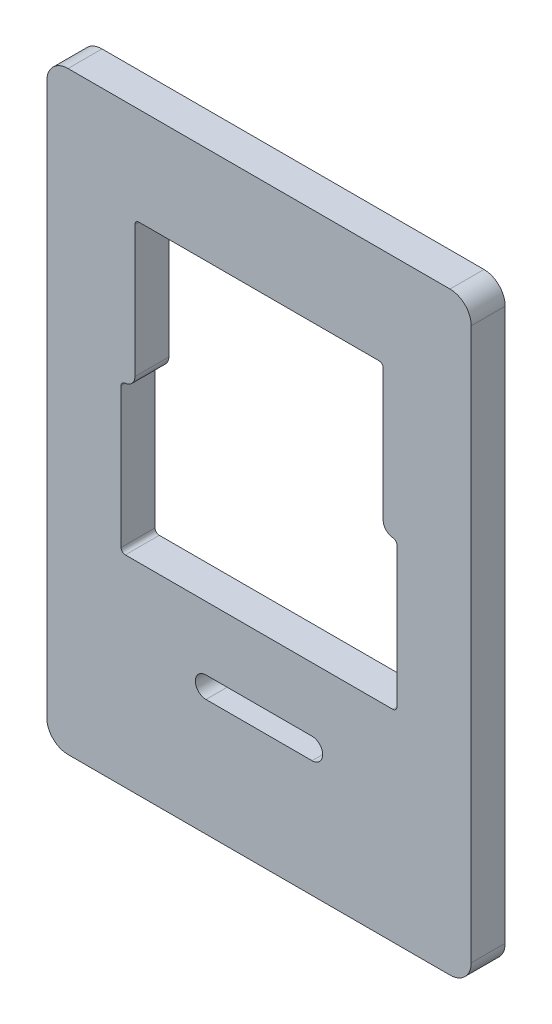
ISO-10303-21;
HEADER;
FILE_DESCRIPTION(('STEP AP214'),'2;1');
FILE_NAME('part.step','',(''),(''),'','','');
FILE_SCHEMA(('AUTOMOTIVE_DESIGN { 1 0 10303 214 1 1 1 1 }'));
ENDSEC;
DATA;
#1=APPLICATION_CONTEXT('core data for automotive mechanical design processes');
#2=APPLICATION_PROTOCOL_DEFINITION('international standard','automotive_design',2000,#1);
#3=PRODUCT_CONTEXT('',#1,'mechanical');
#4=PRODUCT('Part','Part','',(#3));
#5=PRODUCT_RELATED_PRODUCT_CATEGORY('part','',(#4));
#6=PRODUCT_DEFINITION_FORMATION('','',#4);
#7=PRODUCT_DEFINITION_CONTEXT('part definition',#1,'design');
#8=PRODUCT_DEFINITION('design','',#6,#7);
#9=PRODUCT_DEFINITION_SHAPE('','',#8);
#10=(LENGTH_UNIT() NAMED_UNIT(*) SI_UNIT(.MILLI.,.METRE.));
#11=(NAMED_UNIT(*) PLANE_ANGLE_UNIT() SI_UNIT($,.RADIAN.));
#12=(NAMED_UNIT(*) SI_UNIT($,.STERADIAN.) SOLID_ANGLE_UNIT());
#13=UNCERTAINTY_MEASURE_WITH_UNIT(LENGTH_MEASURE(1.E-05),#10,'distance_accuracy_value','');
#14=(GEOMETRIC_REPRESENTATION_CONTEXT(3) GLOBAL_UNCERTAINTY_ASSIGNED_CONTEXT((#13)) GLOBAL_UNIT_ASSIGNED_CONTEXT((#10,
#11,#12)) REPRESENTATION_CONTEXT('',''));
#15=CARTESIAN_POINT('',(0.,0.,0.));
#16=DIRECTION('',(0.,0.,1.));
#17=DIRECTION('',(1.,0.,0.));
#18=AXIS2_PLACEMENT_3D('',#15,#16,#17);
#19=CARTESIAN_POINT('',(10.,14.,-1.6));
#20=DIRECTION('',(1.,0.,0.));
#21=DIRECTION('',(0.,1.,0.));
#22=AXIS2_PLACEMENT_3D('',#19,#20,#21);
#23=PLANE('',#22);
#24=DIRECTION('',(0.,1.,0.));
#25=VECTOR('',#24,1.);
#26=CARTESIAN_POINT('',(10.,14.,0.));
#27=LINE('',#26,#25);
#28=CARTESIAN_POINT('',(10.,-13.,0.));
#29=VERTEX_POINT('',#28);
#30=CARTESIAN_POINT('',(10.,13.,0.));
#31=VERTEX_POINT('',#30);
#32=EDGE_CURVE('E249',#29,#31,#27,.T.);
#33=ORIENTED_EDGE('',*,*,#32,.F.);
#34=DIRECTION('',(0.,0.,1.));
#35=VECTOR('',#34,1.);
#36=CARTESIAN_POINT('',(10.,-13.,-1.6));
#37=LINE('',#36,#35);
#38=CARTESIAN_POINT('',(10.,-13.,-1.6));
#39=VERTEX_POINT('',#38);
#40=EDGE_CURVE('E374',#29,#39,#37,.F.);
#41=ORIENTED_EDGE('',*,*,#40,.T.);
#42=DIRECTION('',(0.,1.,0.));
#43=VECTOR('',#42,1.);
#44=CARTESIAN_POINT('',(10.,14.,-1.6));
#45=LINE('',#44,#43);
#46=CARTESIAN_POINT('',(10.,13.,-1.6));
#47=VERTEX_POINT('',#46);
#48=EDGE_CURVE('E253',#39,#47,#45,.T.);
#49=ORIENTED_EDGE('',*,*,#48,.T.);
#50=DIRECTION('',(0.,0.,1.));
#51=VECTOR('',#50,1.);
#52=CARTESIAN_POINT('',(10.,13.,-1.6));
#53=LINE('',#52,#51);
#54=EDGE_CURVE('E371',#47,#31,#53,.T.);
#55=ORIENTED_EDGE('',*,*,#54,.T.);
#56=EDGE_LOOP('',(#33,#41,#49,#55));
#57=FACE_BOUND('',#56,.T.);
#58=ADVANCED_FACE('F33',(#57),#23,.T.);
#59=CARTESIAN_POINT('',(-10.,-14.,-1.6));
#60=DIRECTION('',(0.,-1.,0.));
#61=DIRECTION('',(0.,0.,-1.));
#62=AXIS2_PLACEMENT_3D('',#59,#60,#61);
#63=PLANE('',#62);
#64=DIRECTION('',(1.,0.,0.));
#65=VECTOR('',#64,1.);
#66=CARTESIAN_POINT('',(-10.,-14.,0.));
#67=LINE('',#66,#65);
#68=CARTESIAN_POINT('',(-9.,-14.,0.));
#69=VERTEX_POINT('',#68);
#70=CARTESIAN_POINT('',(9.,-14.,0.));
#71=VERTEX_POINT('',#70);
#72=EDGE_CURVE('E257',#69,#71,#67,.T.);
#73=ORIENTED_EDGE('',*,*,#72,.F.);
#74=DIRECTION('',(0.,0.,1.));
#75=VECTOR('',#74,1.);
#76=CARTESIAN_POINT('',(-9.,-14.,-1.6));
#77=LINE('',#76,#75);
#78=CARTESIAN_POINT('',(-9.,-14.,-1.6));
#79=VERTEX_POINT('',#78);
#80=EDGE_CURVE('E362',#69,#79,#77,.F.);
#81=ORIENTED_EDGE('',*,*,#80,.T.);
#82=DIRECTION('',(1.,0.,0.));
#83=VECTOR('',#82,1.);
#84=CARTESIAN_POINT('',(-10.,-14.,-1.6));
#85=LINE('',#84,#83);
#86=CARTESIAN_POINT('',(9.,-14.,-1.6));
#87=VERTEX_POINT('',#86);
#88=EDGE_CURVE('E262',#79,#87,#85,.T.);
#89=ORIENTED_EDGE('',*,*,#88,.T.);
#90=DIRECTION('',(0.,0.,1.));
#91=VECTOR('',#90,1.);
#92=CARTESIAN_POINT('',(9.,-14.,-1.6));
#93=LINE('',#92,#91);
#94=EDGE_CURVE('E359',#87,#71,#93,.T.);
#95=ORIENTED_EDGE('',*,*,#94,.T.);
#96=EDGE_LOOP('',(#73,#81,#89,#95));
#97=FACE_BOUND('',#96,.T.);
#98=ADVANCED_FACE('F397',(#97),#63,.T.);
#99=CARTESIAN_POINT('',(-10.,14.,-1.6));
#100=DIRECTION('',(-1.,0.,0.));
#101=DIRECTION('',(0.,-1.,0.));
#102=AXIS2_PLACEMENT_3D('',#99,#100,#101);
#103=PLANE('',#102);
#104=DIRECTION('',(0.,-1.,0.));
#105=VECTOR('',#104,1.);
#106=CARTESIAN_POINT('',(-10.,14.,-1.6));
#107=LINE('',#106,#105);
#108=CARTESIAN_POINT('',(-10.,13.,-1.6));
#109=VERTEX_POINT('',#108);
#110=CARTESIAN_POINT('',(-10.,-13.,-1.6));
#111=VERTEX_POINT('',#110);
#112=EDGE_CURVE('E259',#109,#111,#107,.T.);
#113=ORIENTED_EDGE('',*,*,#112,.T.);
#114=DIRECTION('',(0.,0.,1.));
#115=VECTOR('',#114,1.);
#116=CARTESIAN_POINT('',(-10.,-13.,-1.6));
#117=LINE('',#116,#115);
#118=CARTESIAN_POINT('',(-10.,-13.,0.));
#119=VERTEX_POINT('',#118);
#120=EDGE_CURVE('E348',#111,#119,#117,.T.);
#121=ORIENTED_EDGE('',*,*,#120,.T.);
#122=DIRECTION('',(0.,-1.,0.));
#123=VECTOR('',#122,1.);
#124=CARTESIAN_POINT('',(-10.,14.,0.));
#125=LINE('',#124,#123);
#126=CARTESIAN_POINT('',(-10.,13.,0.));
#127=VERTEX_POINT('',#126);
#128=EDGE_CURVE('E271',#127,#119,#125,.T.);
#129=ORIENTED_EDGE('',*,*,#128,.F.);
#130=DIRECTION('',(0.,0.,1.));
#131=VECTOR('',#130,1.);
#132=CARTESIAN_POINT('',(-10.,13.,-1.6));
#133=LINE('',#132,#131);
#134=EDGE_CURVE('E346',#127,#109,#133,.F.);
#135=ORIENTED_EDGE('',*,*,#134,.T.);
#136=EDGE_LOOP('',(#113,#121,#129,#135));
#137=FACE_BOUND('',#136,.T.);
#138=ADVANCED_FACE('F404',(#137),#103,.T.);
#139=CARTESIAN_POINT('',(-10.,14.,-1.6));
#140=DIRECTION('',(0.,1.,0.));
#141=DIRECTION('',(0.,0.,1.));
#142=AXIS2_PLACEMENT_3D('',#139,#140,#141);
#143=PLANE('',#142);
#144=DIRECTION('',(-1.,0.,0.));
#145=VECTOR('',#144,1.);
#146=CARTESIAN_POINT('',(-10.,14.,0.));
#147=LINE('',#146,#145);
#148=CARTESIAN_POINT('',(9.,14.,0.));
#149=VERTEX_POINT('',#148);
#150=CARTESIAN_POINT('',(-9.,14.,0.));
#151=VERTEX_POINT('',#150);
#152=EDGE_CURVE('E268',#149,#151,#147,.T.);
#153=ORIENTED_EDGE('',*,*,#152,.F.);
#154=DIRECTION('',(0.,0.,1.));
#155=VECTOR('',#154,1.);
#156=CARTESIAN_POINT('',(9.,14.,-1.6));
#157=LINE('',#156,#155);
#158=CARTESIAN_POINT('',(9.,14.,-1.6));
#159=VERTEX_POINT('',#158);
#160=EDGE_CURVE('E11',#149,#159,#157,.F.);
#161=ORIENTED_EDGE('',*,*,#160,.T.);
#162=DIRECTION('',(-1.,0.,0.));
#163=VECTOR('',#162,1.);
#164=CARTESIAN_POINT('',(-10.,14.,-1.6));
#165=LINE('',#164,#163);
#166=CARTESIAN_POINT('',(-9.,14.,-1.6));
#167=VERTEX_POINT('',#166);
#168=EDGE_CURVE('E256',#159,#167,#165,.T.);
#169=ORIENTED_EDGE('',*,*,#168,.T.);
#170=DIRECTION('',(0.,0.,1.));
#171=VECTOR('',#170,1.);
#172=CARTESIAN_POINT('',(-9.,14.,-1.6));
#173=LINE('',#172,#171);
#174=EDGE_CURVE('E41',#167,#151,#173,.T.);
#175=ORIENTED_EDGE('',*,*,#174,.T.);
#176=EDGE_LOOP('',(#153,#161,#169,#175));
#177=FACE_BOUND('',#176,.T.);
#178=ADVANCED_FACE('F377',(#177),#143,.T.);
#179=CARTESIAN_POINT('',(0.,0.,-1.6));
#180=DIRECTION('',(0.,0.,1.));
#181=DIRECTION('',(1.,0.,0.));
#182=AXIS2_PLACEMENT_3D('',#179,#180,#181);
#183=PLANE('',#182);
#184=DIRECTION('',(0.,1.,0.));
#185=VECTOR('',#184,1.);
#186=CARTESIAN_POINT('',(6.5,2.5,-1.6));
#187=LINE('',#186,#185);
#188=CARTESIAN_POINT('',(6.5,-4.3,-1.6));
#189=VERTEX_POINT('',#188);
#190=CARTESIAN_POINT('',(6.5,2.30178799781155,-1.6));
#191=VERTEX_POINT('',#190);
#192=EDGE_CURVE('E646',#189,#191,#187,.T.);
#193=ORIENTED_EDGE('',*,*,#192,.T.);
#194=CARTESIAN_POINT('',(6.3,2.30178799781155,-1.6));
#195=DIRECTION('',(0.,0.,1.));
#196=DIRECTION('',(1.,0.,0.));
#197=AXIS2_PLACEMENT_3D('',#194,#195,#196);
#198=CIRCLE('',#197,0.2);
#199=CARTESIAN_POINT('',(6.31428571428571,2.50127714129396,-1.6));
#200=VERTEX_POINT('',#199);
#201=EDGE_CURVE('E332',#191,#200,#198,.T.);
#202=ORIENTED_EDGE('',*,*,#201,.T.);
#203=CARTESIAN_POINT('',(6.35,3.,-1.6));
#204=DIRECTION('',(0.,0.,1.));
#205=DIRECTION('',(1.,0.,0.));
#206=AXIS2_PLACEMENT_3D('',#203,#204,#205);
#207=CIRCLE('',#206,0.5);
#208=CARTESIAN_POINT('',(5.85,3.,-1.6));
#209=VERTEX_POINT('',#208);
#210=EDGE_CURVE('E287',#200,#209,#207,.F.);
#211=ORIENTED_EDGE('',*,*,#210,.T.);
#212=DIRECTION('',(0.,1.,0.));
#213=VECTOR('',#212,1.);
#214=CARTESIAN_POINT('',(5.85,9.4,-1.6));
#215=LINE('',#214,#213);
#216=CARTESIAN_POINT('',(5.85,9.2,-1.6));
#217=VERTEX_POINT('',#216);
#218=EDGE_CURVE('E674',#209,#217,#215,.T.);
#219=ORIENTED_EDGE('',*,*,#218,.T.);
#220=CARTESIAN_POINT('',(5.65,9.2,-1.6));
#221=DIRECTION('',(0.,0.,1.));
#222=DIRECTION('',(1.,0.,0.));
#223=AXIS2_PLACEMENT_3D('',#220,#221,#222);
#224=CIRCLE('',#223,0.2);
#225=CARTESIAN_POINT('',(5.65,9.4,-1.6));
#226=VERTEX_POINT('',#225);
#227=EDGE_CURVE('E344',#217,#226,#224,.T.);
#228=ORIENTED_EDGE('',*,*,#227,.T.);
#229=DIRECTION('',(-1.,0.,0.));
#230=VECTOR('',#229,1.);
#231=CARTESIAN_POINT('',(-5.85,9.4,-1.6));
#232=LINE('',#231,#230);
#233=CARTESIAN_POINT('',(-5.65,9.4,-1.6));
#234=VERTEX_POINT('',#233);
#235=EDGE_CURVE('E705',#226,#234,#232,.T.);
#236=ORIENTED_EDGE('',*,*,#235,.T.);
#237=CARTESIAN_POINT('',(-5.65,9.2,-1.6));
#238=DIRECTION('',(0.,0.,1.));
#239=DIRECTION('',(1.,0.,0.));
#240=AXIS2_PLACEMENT_3D('',#237,#238,#239);
#241=CIRCLE('',#240,0.2);
#242=CARTESIAN_POINT('',(-5.85,9.2,-1.6));
#243=VERTEX_POINT('',#242);
#244=EDGE_CURVE('E340',#234,#243,#241,.T.);
#245=ORIENTED_EDGE('',*,*,#244,.T.);
#246=DIRECTION('',(0.,-1.,0.));
#247=VECTOR('',#246,1.);
#248=CARTESIAN_POINT('',(-5.85,9.4,-1.6));
#249=LINE('',#248,#247);
#250=CARTESIAN_POINT('',(-5.85,3.,-1.6));
#251=VERTEX_POINT('',#250);
#252=EDGE_CURVE('E671',#243,#251,#249,.T.);
#253=ORIENTED_EDGE('',*,*,#252,.T.);
#254=CARTESIAN_POINT('',(-6.35,3.,-1.6));
#255=DIRECTION('',(0.,0.,1.));
#256=DIRECTION('',(1.,0.,0.));
#257=AXIS2_PLACEMENT_3D('',#254,#255,#256);
#258=CIRCLE('',#257,0.5);
#259=CARTESIAN_POINT('',(-6.31428571428571,2.50127714129396,-1.6));
#260=VERTEX_POINT('',#259);
#261=EDGE_CURVE('E284',#251,#260,#258,.F.);
#262=ORIENTED_EDGE('',*,*,#261,.T.);
#263=CARTESIAN_POINT('',(-6.3,2.30178799781155,-1.6));
#264=DIRECTION('',(0.,0.,1.));
#265=DIRECTION('',(1.,0.,0.));
#266=AXIS2_PLACEMENT_3D('',#263,#264,#265);
#267=CIRCLE('',#266,0.2);
#268=CARTESIAN_POINT('',(-6.5,2.30178799781155,-1.6));
#269=VERTEX_POINT('',#268);
#270=EDGE_CURVE('E336',#260,#269,#267,.T.);
#271=ORIENTED_EDGE('',*,*,#270,.T.);
#272=DIRECTION('',(0.,-1.,0.));
#273=VECTOR('',#272,1.);
#274=CARTESIAN_POINT('',(-6.5,2.5,-1.6));
#275=LINE('',#274,#273);
#276=CARTESIAN_POINT('',(-6.5,-4.3,-1.6));
#277=VERTEX_POINT('',#276);
#278=EDGE_CURVE('E652',#269,#277,#275,.T.);
#279=ORIENTED_EDGE('',*,*,#278,.T.);
#280=CARTESIAN_POINT('',(-6.3,-4.3,-1.6));
#281=DIRECTION('',(0.,0.,1.));
#282=DIRECTION('',(1.,0.,0.));
#283=AXIS2_PLACEMENT_3D('',#280,#281,#282);
#284=CIRCLE('',#283,0.2);
#285=CARTESIAN_POINT('',(-6.3,-4.5,-1.6));
#286=VERTEX_POINT('',#285);
#287=EDGE_CURVE('E324',#277,#286,#284,.T.);
#288=ORIENTED_EDGE('',*,*,#287,.T.);
#289=DIRECTION('',(1.,0.,0.));
#290=VECTOR('',#289,1.);
#291=CARTESIAN_POINT('',(-6.5,-4.5,-1.6));
#292=LINE('',#291,#290);
#293=CARTESIAN_POINT('',(6.3,-4.5,-1.6));
#294=VERTEX_POINT('',#293);
#295=EDGE_CURVE('E243',#286,#294,#292,.T.);
#296=ORIENTED_EDGE('',*,*,#295,.T.);
#297=CARTESIAN_POINT('',(6.3,-4.3,-1.6));
#298=DIRECTION('',(0.,0.,1.));
#299=DIRECTION('',(1.,0.,0.));
#300=AXIS2_PLACEMENT_3D('',#297,#298,#299);
#301=CIRCLE('',#300,0.2);
#302=EDGE_CURVE('E328',#294,#189,#301,.T.);
#303=ORIENTED_EDGE('',*,*,#302,.T.);
#304=EDGE_LOOP('',(#193,#202,#211,#219,#228,#236,#245,#253,#262,#271,#279,#288,#296,#303));
#305=FACE_BOUND('',#304,.T.);
#306=DIRECTION('',(-1.,0.,0.));
#307=VECTOR('',#306,1.);
#308=CARTESIAN_POINT('',(-2.5,-7.5,-1.6));
#309=LINE('',#308,#307);
#310=CARTESIAN_POINT('',(2.5,-7.5,-1.6));
#311=VERTEX_POINT('',#310);
#312=CARTESIAN_POINT('',(-2.5,-7.5,-1.6));
#313=VERTEX_POINT('',#312);
#314=EDGE_CURVE('E218',#311,#313,#309,.T.);
#315=ORIENTED_EDGE('',*,*,#314,.T.);
#316=CARTESIAN_POINT('',(-2.5,-8.,-1.6));
#317=DIRECTION('',(0.,0.,1.));
#318=DIRECTION('',(1.,0.,0.));
#319=AXIS2_PLACEMENT_3D('',#316,#317,#318);
#320=CIRCLE('',#319,0.5);
#321=CARTESIAN_POINT('',(-2.5,-8.5,-1.6));
#322=VERTEX_POINT('',#321);
#323=EDGE_CURVE('E210',#313,#322,#320,.T.);
#324=ORIENTED_EDGE('',*,*,#323,.T.);
#325=DIRECTION('',(1.,0.,0.));
#326=VECTOR('',#325,1.);
#327=CARTESIAN_POINT('',(-2.5,-8.5,-1.6));
#328=LINE('',#327,#326);
#329=CARTESIAN_POINT('',(2.5,-8.5,-1.6));
#330=VERTEX_POINT('',#329);
#331=EDGE_CURVE('E222',#322,#330,#328,.T.);
#332=ORIENTED_EDGE('',*,*,#331,.T.);
#333=CARTESIAN_POINT('',(2.5,-8.,-1.6));
#334=DIRECTION('',(0.,0.,1.));
#335=DIRECTION('',(1.,0.,0.));
#336=AXIS2_PLACEMENT_3D('',#333,#334,#335);
#337=CIRCLE('',#336,0.5);
#338=EDGE_CURVE('E226',#330,#311,#337,.T.);
#339=ORIENTED_EDGE('',*,*,#338,.T.);
#340=EDGE_LOOP('',(#315,#324,#332,#339));
#341=FACE_BOUND('',#340,.T.);
#342=ORIENTED_EDGE('',*,*,#88,.F.);
#343=CARTESIAN_POINT('',(-9.,-13.,-1.6));
#344=DIRECTION('',(0.,0.,1.));
#345=DIRECTION('',(1.,0.,0.));
#346=AXIS2_PLACEMENT_3D('',#343,#344,#345);
#347=CIRCLE('',#346,1.);
#348=EDGE_CURVE('E369',#79,#111,#347,.F.);
#349=ORIENTED_EDGE('',*,*,#348,.T.);
#350=ORIENTED_EDGE('',*,*,#112,.F.);
#351=CARTESIAN_POINT('',(-9.,13.,-1.6));
#352=DIRECTION('',(0.,0.,1.));
#353=DIRECTION('',(1.,0.,0.));
#354=AXIS2_PLACEMENT_3D('',#351,#352,#353);
#355=CIRCLE('',#354,1.);
#356=EDGE_CURVE('E48',#109,#167,#355,.F.);
#357=ORIENTED_EDGE('',*,*,#356,.T.);
#358=ORIENTED_EDGE('',*,*,#168,.F.);
#359=CARTESIAN_POINT('',(9.,13.,-1.6));
#360=DIRECTION('',(0.,0.,1.));
#361=DIRECTION('',(1.,0.,0.));
#362=AXIS2_PLACEMENT_3D('',#359,#360,#361);
#363=CIRCLE('',#362,1.);
#364=EDGE_CURVE('E365',#159,#47,#363,.F.);
#365=ORIENTED_EDGE('',*,*,#364,.T.);
#366=ORIENTED_EDGE('',*,*,#48,.F.);
#367=CARTESIAN_POINT('',(9.,-13.,-1.6));
#368=DIRECTION('',(0.,0.,1.));
#369=DIRECTION('',(1.,0.,0.));
#370=AXIS2_PLACEMENT_3D('',#367,#368,#369);
#371=CIRCLE('',#370,1.);
#372=EDGE_CURVE('E367',#39,#87,#371,.F.);
#373=ORIENTED_EDGE('',*,*,#372,.T.);
#374=EDGE_LOOP('',(#342,#349,#350,#357,#358,#365,#366,#373));
#375=FACE_BOUND('',#374,.T.);
#376=ADVANCED_FACE('F228',(#305,#341,#375),#183,.F.);
#377=CARTESIAN_POINT('',(0.,0.,0.));
#378=DIRECTION('',(0.,0.,1.));
#379=DIRECTION('',(1.,0.,0.));
#380=AXIS2_PLACEMENT_3D('',#377,#378,#379);
#381=PLANE('',#380);
#382=DIRECTION('',(0.,1.,0.));
#383=VECTOR('',#382,1.);
#384=CARTESIAN_POINT('',(5.85,9.4,0.));
#385=LINE('',#384,#383);
#386=CARTESIAN_POINT('',(5.85,3.,0.));
#387=VERTEX_POINT('',#386);
#388=CARTESIAN_POINT('',(5.85,9.2,0.));
#389=VERTEX_POINT('',#388);
#390=EDGE_CURVE('E662',#387,#389,#385,.T.);
#391=ORIENTED_EDGE('',*,*,#390,.F.);
#392=CARTESIAN_POINT('',(6.35,3.,0.));
#393=DIRECTION('',(0.,0.,1.));
#394=DIRECTION('',(1.,0.,0.));
#395=AXIS2_PLACEMENT_3D('',#392,#393,#394);
#396=CIRCLE('',#395,0.5);
#397=CARTESIAN_POINT('',(6.31428571428571,2.50127714129396,0.));
#398=VERTEX_POINT('',#397);
#399=EDGE_CURVE('E281',#387,#398,#396,.T.);
#400=ORIENTED_EDGE('',*,*,#399,.T.);
#401=CARTESIAN_POINT('',(6.3,2.30178799781155,0.));
#402=DIRECTION('',(0.,0.,1.));
#403=DIRECTION('',(1.,0.,0.));
#404=AXIS2_PLACEMENT_3D('',#401,#402,#403);
#405=CIRCLE('',#404,0.2);
#406=CARTESIAN_POINT('',(6.5,2.30178799781155,0.));
#407=VERTEX_POINT('',#406);
#408=EDGE_CURVE('E330',#398,#407,#405,.F.);
#409=ORIENTED_EDGE('',*,*,#408,.T.);
#410=DIRECTION('',(0.,1.,0.));
#411=VECTOR('',#410,1.);
#412=CARTESIAN_POINT('',(6.5,2.5,0.));
#413=LINE('',#412,#411);
#414=CARTESIAN_POINT('',(6.5,-4.3,0.));
#415=VERTEX_POINT('',#414);
#416=EDGE_CURVE('E679',#415,#407,#413,.T.);
#417=ORIENTED_EDGE('',*,*,#416,.F.);
#418=CARTESIAN_POINT('',(6.3,-4.3,0.));
#419=DIRECTION('',(0.,0.,1.));
#420=DIRECTION('',(1.,0.,0.));
#421=AXIS2_PLACEMENT_3D('',#418,#419,#420);
#422=CIRCLE('',#421,0.2);
#423=CARTESIAN_POINT('',(6.3,-4.5,0.));
#424=VERTEX_POINT('',#423);
#425=EDGE_CURVE('E326',#415,#424,#422,.F.);
#426=ORIENTED_EDGE('',*,*,#425,.T.);
#427=DIRECTION('',(1.,0.,0.));
#428=VECTOR('',#427,1.);
#429=CARTESIAN_POINT('',(-6.5,-4.5,0.));
#430=LINE('',#429,#428);
#431=CARTESIAN_POINT('',(-6.3,-4.5,0.));
#432=VERTEX_POINT('',#431);
#433=EDGE_CURVE('E236',#432,#424,#430,.T.);
#434=ORIENTED_EDGE('',*,*,#433,.F.);
#435=CARTESIAN_POINT('',(-6.3,-4.3,0.));
#436=DIRECTION('',(0.,0.,1.));
#437=DIRECTION('',(1.,0.,0.));
#438=AXIS2_PLACEMENT_3D('',#435,#436,#437);
#439=CIRCLE('',#438,0.2);
#440=CARTESIAN_POINT('',(-6.5,-4.3,0.));
#441=VERTEX_POINT('',#440);
#442=EDGE_CURVE('E322',#432,#441,#439,.F.);
#443=ORIENTED_EDGE('',*,*,#442,.T.);
#444=DIRECTION('',(0.,-1.,0.));
#445=VECTOR('',#444,1.);
#446=CARTESIAN_POINT('',(-6.5,2.5,0.));
#447=LINE('',#446,#445);
#448=CARTESIAN_POINT('',(-6.5,2.30178799781155,0.));
#449=VERTEX_POINT('',#448);
#450=EDGE_CURVE('E680',#449,#441,#447,.T.);
#451=ORIENTED_EDGE('',*,*,#450,.F.);
#452=CARTESIAN_POINT('',(-6.3,2.30178799781155,0.));
#453=DIRECTION('',(0.,0.,1.));
#454=DIRECTION('',(1.,0.,0.));
#455=AXIS2_PLACEMENT_3D('',#452,#453,#454);
#456=CIRCLE('',#455,0.2);
#457=CARTESIAN_POINT('',(-6.31428571428571,2.50127714129396,0.));
#458=VERTEX_POINT('',#457);
#459=EDGE_CURVE('E334',#449,#458,#456,.F.);
#460=ORIENTED_EDGE('',*,*,#459,.T.);
#461=CARTESIAN_POINT('',(-6.35,3.,0.));
#462=DIRECTION('',(0.,0.,1.));
#463=DIRECTION('',(1.,0.,0.));
#464=AXIS2_PLACEMENT_3D('',#461,#462,#463);
#465=CIRCLE('',#464,0.5);
#466=CARTESIAN_POINT('',(-5.85,3.,0.));
#467=VERTEX_POINT('',#466);
#468=EDGE_CURVE('E278',#458,#467,#465,.T.);
#469=ORIENTED_EDGE('',*,*,#468,.T.);
#470=DIRECTION('',(0.,-1.,0.));
#471=VECTOR('',#470,1.);
#472=CARTESIAN_POINT('',(-5.85,9.4,0.));
#473=LINE('',#472,#471);
#474=CARTESIAN_POINT('',(-5.85,9.2,0.));
#475=VERTEX_POINT('',#474);
#476=EDGE_CURVE('E668',#475,#467,#473,.T.);
#477=ORIENTED_EDGE('',*,*,#476,.F.);
#478=CARTESIAN_POINT('',(-5.65,9.2,0.));
#479=DIRECTION('',(0.,0.,1.));
#480=DIRECTION('',(1.,0.,0.));
#481=AXIS2_PLACEMENT_3D('',#478,#479,#480);
#482=CIRCLE('',#481,0.2);
#483=CARTESIAN_POINT('',(-5.65,9.4,0.));
#484=VERTEX_POINT('',#483);
#485=EDGE_CURVE('E338',#475,#484,#482,.F.);
#486=ORIENTED_EDGE('',*,*,#485,.T.);
#487=DIRECTION('',(-1.,0.,0.));
#488=VECTOR('',#487,1.);
#489=CARTESIAN_POINT('',(-5.85,9.4,0.));
#490=LINE('',#489,#488);
#491=CARTESIAN_POINT('',(5.65,9.4,0.));
#492=VERTEX_POINT('',#491);
#493=EDGE_CURVE('E665',#492,#484,#490,.T.);
#494=ORIENTED_EDGE('',*,*,#493,.F.);
#495=CARTESIAN_POINT('',(5.65,9.2,0.));
#496=DIRECTION('',(0.,0.,1.));
#497=DIRECTION('',(1.,0.,0.));
#498=AXIS2_PLACEMENT_3D('',#495,#496,#497);
#499=CIRCLE('',#498,0.2);
#500=EDGE_CURVE('E342',#492,#389,#499,.F.);
#501=ORIENTED_EDGE('',*,*,#500,.T.);
#502=EDGE_LOOP('',(#391,#400,#409,#417,#426,#434,#443,#451,#460,#469,#477,#486,#494,#501));
#503=FACE_BOUND('',#502,.T.);
#504=CARTESIAN_POINT('',(-2.5,-8.,0.));
#505=DIRECTION('',(0.,0.,1.));
#506=DIRECTION('',(1.,0.,0.));
#507=AXIS2_PLACEMENT_3D('',#504,#505,#506);
#508=CIRCLE('',#507,0.5);
#509=CARTESIAN_POINT('',(-2.5,-7.5,0.));
#510=VERTEX_POINT('',#509);
#511=CARTESIAN_POINT('',(-2.5,-8.5,0.));
#512=VERTEX_POINT('',#511);
#513=EDGE_CURVE('E213',#510,#512,#508,.T.);
#514=ORIENTED_EDGE('',*,*,#513,.F.);
#515=DIRECTION('',(-1.,0.,0.));
#516=VECTOR('',#515,1.);
#517=CARTESIAN_POINT('',(-2.5,-7.5,0.));
#518=LINE('',#517,#516);
#519=CARTESIAN_POINT('',(2.5,-7.5,0.));
#520=VERTEX_POINT('',#519);
#521=EDGE_CURVE('E230',#520,#510,#518,.T.);
#522=ORIENTED_EDGE('',*,*,#521,.F.);
#523=CARTESIAN_POINT('',(2.5,-8.,0.));
#524=DIRECTION('',(0.,0.,1.));
#525=DIRECTION('',(1.,0.,0.));
#526=AXIS2_PLACEMENT_3D('',#523,#524,#525);
#527=CIRCLE('',#526,0.5);
#528=CARTESIAN_POINT('',(2.5,-8.5,0.));
#529=VERTEX_POINT('',#528);
#530=EDGE_CURVE('E233',#529,#520,#527,.T.);
#531=ORIENTED_EDGE('',*,*,#530,.F.);
#532=DIRECTION('',(1.,0.,0.));
#533=VECTOR('',#532,1.);
#534=CARTESIAN_POINT('',(-2.5,-8.5,0.));
#535=LINE('',#534,#533);
#536=EDGE_CURVE('E242',#512,#529,#535,.T.);
#537=ORIENTED_EDGE('',*,*,#536,.F.);
#538=EDGE_LOOP('',(#514,#522,#531,#537));
#539=FACE_BOUND('',#538,.T.);
#540=ORIENTED_EDGE('',*,*,#128,.T.);
#541=CARTESIAN_POINT('',(-9.,-13.,0.));
#542=DIRECTION('',(0.,0.,1.));
#543=DIRECTION('',(1.,0.,0.));
#544=AXIS2_PLACEMENT_3D('',#541,#542,#543);
#545=CIRCLE('',#544,1.);
#546=EDGE_CURVE('E357',#119,#69,#545,.T.);
#547=ORIENTED_EDGE('',*,*,#546,.T.);
#548=ORIENTED_EDGE('',*,*,#72,.T.);
#549=CARTESIAN_POINT('',(9.,-13.,0.));
#550=DIRECTION('',(0.,0.,1.));
#551=DIRECTION('',(1.,0.,0.));
#552=AXIS2_PLACEMENT_3D('',#549,#550,#551);
#553=CIRCLE('',#552,1.);
#554=EDGE_CURVE('E355',#71,#29,#553,.T.);
#555=ORIENTED_EDGE('',*,*,#554,.T.);
#556=ORIENTED_EDGE('',*,*,#32,.T.);
#557=CARTESIAN_POINT('',(9.,13.,0.));
#558=DIRECTION('',(0.,0.,1.));
#559=DIRECTION('',(1.,0.,0.));
#560=AXIS2_PLACEMENT_3D('',#557,#558,#559);
#561=CIRCLE('',#560,1.);
#562=EDGE_CURVE('E353',#31,#149,#561,.T.);
#563=ORIENTED_EDGE('',*,*,#562,.T.);
#564=ORIENTED_EDGE('',*,*,#152,.T.);
#565=CARTESIAN_POINT('',(-9.,13.,0.));
#566=DIRECTION('',(0.,0.,1.));
#567=DIRECTION('',(1.,0.,0.));
#568=AXIS2_PLACEMENT_3D('',#565,#566,#567);
#569=CIRCLE('',#568,1.);
#570=EDGE_CURVE('E351',#151,#127,#569,.T.);
#571=ORIENTED_EDGE('',*,*,#570,.T.);
#572=EDGE_LOOP('',(#540,#547,#548,#555,#556,#563,#564,#571));
#573=FACE_BOUND('',#572,.T.);
#574=ADVANCED_FACE('F380',(#503,#539,#573),#381,.T.);
#575=CARTESIAN_POINT('',(-2.5,-8.,-1.6));
#576=DIRECTION('',(0.,0.,1.));
#577=DIRECTION('',(1.,0.,0.));
#578=AXIS2_PLACEMENT_3D('',#575,#576,#577);
#579=CYLINDRICAL_SURFACE('',#578,0.5);
#580=ORIENTED_EDGE('',*,*,#513,.T.);
#581=DIRECTION('',(0.,0.,1.));
#582=VECTOR('',#581,1.);
#583=CARTESIAN_POINT('',(-2.5,-8.5,-1.6));
#584=LINE('',#583,#582);
#585=EDGE_CURVE('E206',#322,#512,#584,.T.);
#586=ORIENTED_EDGE('',*,*,#585,.F.);
#587=ORIENTED_EDGE('',*,*,#323,.F.);
#588=DIRECTION('',(0.,0.,1.));
#589=VECTOR('',#588,1.);
#590=CARTESIAN_POINT('',(-2.5,-7.5,-1.6));
#591=LINE('',#590,#589);
#592=EDGE_CURVE('E247',#313,#510,#591,.T.);
#593=ORIENTED_EDGE('',*,*,#592,.T.);
#594=EDGE_LOOP('',(#580,#586,#587,#593));
#595=FACE_BOUND('',#594,.T.);
#596=ADVANCED_FACE('F208',(#595),#579,.F.);
#597=CARTESIAN_POINT('',(-2.5,-7.5,-1.6));
#598=DIRECTION('',(0.,1.,0.));
#599=DIRECTION('',(-1.,0.,0.));
#600=AXIS2_PLACEMENT_3D('',#597,#598,#599);
#601=PLANE('',#600);
#602=ORIENTED_EDGE('',*,*,#521,.T.);
#603=ORIENTED_EDGE('',*,*,#592,.F.);
#604=ORIENTED_EDGE('',*,*,#314,.F.);
#605=DIRECTION('',(0.,0.,1.));
#606=VECTOR('',#605,1.);
#607=CARTESIAN_POINT('',(2.5,-7.5,-1.6));
#608=LINE('',#607,#606);
#609=EDGE_CURVE('E250',#311,#520,#608,.T.);
#610=ORIENTED_EDGE('',*,*,#609,.T.);
#611=EDGE_LOOP('',(#602,#603,#604,#610));
#612=FACE_BOUND('',#611,.T.);
#613=ADVANCED_FACE('F585',(#612),#601,.F.);
#614=CARTESIAN_POINT('',(2.5,-8.,-1.6));
#615=DIRECTION('',(0.,0.,1.));
#616=DIRECTION('',(1.,0.,0.));
#617=AXIS2_PLACEMENT_3D('',#614,#615,#616);
#618=CYLINDRICAL_SURFACE('',#617,0.5);
#619=ORIENTED_EDGE('',*,*,#530,.T.);
#620=ORIENTED_EDGE('',*,*,#609,.F.);
#621=ORIENTED_EDGE('',*,*,#338,.F.);
#622=DIRECTION('',(0.,0.,1.));
#623=VECTOR('',#622,1.);
#624=CARTESIAN_POINT('',(2.5,-8.5,-1.6));
#625=LINE('',#624,#623);
#626=EDGE_CURVE('E217',#330,#529,#625,.T.);
#627=ORIENTED_EDGE('',*,*,#626,.T.);
#628=EDGE_LOOP('',(#619,#620,#621,#627));
#629=FACE_BOUND('',#628,.T.);
#630=ADVANCED_FACE('F577',(#629),#618,.F.);
#631=CARTESIAN_POINT('',(-2.5,-8.5,-1.6));
#632=DIRECTION('',(0.,-1.,0.));
#633=DIRECTION('',(1.,0.,0.));
#634=AXIS2_PLACEMENT_3D('',#631,#632,#633);
#635=PLANE('',#634);
#636=ORIENTED_EDGE('',*,*,#536,.T.);
#637=ORIENTED_EDGE('',*,*,#626,.F.);
#638=ORIENTED_EDGE('',*,*,#331,.F.);
#639=ORIENTED_EDGE('',*,*,#585,.T.);
#640=EDGE_LOOP('',(#636,#637,#638,#639));
#641=FACE_BOUND('',#640,.T.);
#642=ADVANCED_FACE('F223',(#641),#635,.F.);
#643=CARTESIAN_POINT('',(6.5,2.5,-1.6));
#644=DIRECTION('',(1.,0.,0.));
#645=DIRECTION('',(0.,0.,-1.));
#646=AXIS2_PLACEMENT_3D('',#643,#644,#645);
#647=PLANE('',#646);
#648=ORIENTED_EDGE('',*,*,#192,.F.);
#649=DIRECTION('',(0.,0.,1.));
#650=VECTOR('',#649,1.);
#651=CARTESIAN_POINT('',(6.5,-4.3,0.));
#652=LINE('',#651,#650);
#653=EDGE_CURVE('E304',#189,#415,#652,.T.);
#654=ORIENTED_EDGE('',*,*,#653,.T.);
#655=ORIENTED_EDGE('',*,*,#416,.T.);
#656=DIRECTION('',(0.,0.,1.));
#657=VECTOR('',#656,1.);
#658=CARTESIAN_POINT('',(6.5,2.30178799781155,-1.6));
#659=LINE('',#658,#657);
#660=EDGE_CURVE('E302',#407,#191,#659,.F.);
#661=ORIENTED_EDGE('',*,*,#660,.T.);
#662=EDGE_LOOP('',(#648,#654,#655,#661));
#663=FACE_BOUND('',#662,.T.);
#664=ADVANCED_FACE('F560',(#663),#647,.F.);
#665=CARTESIAN_POINT('',(-6.5,-4.5,-1.6));
#666=DIRECTION('',(0.,-1.,0.));
#667=DIRECTION('',(0.,0.,-1.));
#668=AXIS2_PLACEMENT_3D('',#665,#666,#667);
#669=PLANE('',#668);
#670=ORIENTED_EDGE('',*,*,#295,.F.);
#671=DIRECTION('',(0.,0.,1.));
#672=VECTOR('',#671,1.);
#673=CARTESIAN_POINT('',(-6.3,-4.5,0.));
#674=LINE('',#673,#672);
#675=EDGE_CURVE('E294',#286,#432,#674,.T.);
#676=ORIENTED_EDGE('',*,*,#675,.T.);
#677=ORIENTED_EDGE('',*,*,#433,.T.);
#678=DIRECTION('',(0.,0.,1.));
#679=VECTOR('',#678,1.);
#680=CARTESIAN_POINT('',(6.3,-4.5,-1.6));
#681=LINE('',#680,#679);
#682=EDGE_CURVE('E292',#424,#294,#681,.F.);
#683=ORIENTED_EDGE('',*,*,#682,.T.);
#684=EDGE_LOOP('',(#670,#676,#677,#683));
#685=FACE_BOUND('',#684,.T.);
#686=ADVANCED_FACE('F551',(#685),#669,.F.);
#687=CARTESIAN_POINT('',(-6.5,2.5,-1.6));
#688=DIRECTION('',(-1.,0.,0.));
#689=DIRECTION('',(0.,-1.,0.));
#690=AXIS2_PLACEMENT_3D('',#687,#688,#689);
#691=PLANE('',#690);
#692=ORIENTED_EDGE('',*,*,#450,.T.);
#693=DIRECTION('',(0.,0.,1.));
#694=VECTOR('',#693,1.);
#695=CARTESIAN_POINT('',(-6.5,-4.3,-1.6));
#696=LINE('',#695,#694);
#697=EDGE_CURVE('E300',#441,#277,#696,.F.);
#698=ORIENTED_EDGE('',*,*,#697,.T.);
#699=ORIENTED_EDGE('',*,*,#278,.F.);
#700=DIRECTION('',(0.,0.,1.));
#701=VECTOR('',#700,1.);
#702=CARTESIAN_POINT('',(-6.5,2.30178799781155,-1.6));
#703=LINE('',#702,#701);
#704=EDGE_CURVE('E297',#269,#449,#703,.T.);
#705=ORIENTED_EDGE('',*,*,#704,.T.);
#706=EDGE_LOOP('',(#692,#698,#699,#705));
#707=FACE_BOUND('',#706,.T.);
#708=ADVANCED_FACE('F542',(#707),#691,.F.);
#709=CARTESIAN_POINT('',(5.85,9.4,-1.6));
#710=DIRECTION('',(1.,0.,0.));
#711=DIRECTION('',(0.,1.,0.));
#712=AXIS2_PLACEMENT_3D('',#709,#710,#711);
#713=PLANE('',#712);
#714=ORIENTED_EDGE('',*,*,#390,.T.);
#715=DIRECTION('',(0.,0.,1.));
#716=VECTOR('',#715,1.);
#717=CARTESIAN_POINT('',(5.85,9.2,-1.6));
#718=LINE('',#717,#716);
#719=EDGE_CURVE('E320',#389,#217,#718,.F.);
#720=ORIENTED_EDGE('',*,*,#719,.T.);
#721=ORIENTED_EDGE('',*,*,#218,.F.);
#722=DIRECTION('',(0.,0.,1.));
#723=VECTOR('',#722,1.);
#724=CARTESIAN_POINT('',(5.85,3.,-1.6));
#725=LINE('',#724,#723);
#726=EDGE_CURVE('E265',#209,#387,#725,.T.);
#727=ORIENTED_EDGE('',*,*,#726,.T.);
#728=EDGE_LOOP('',(#714,#720,#721,#727));
#729=FACE_BOUND('',#728,.T.);
#730=ADVANCED_FACE('F533',(#729),#713,.F.);
#731=CARTESIAN_POINT('',(-5.85,9.4,-1.6));
#732=DIRECTION('',(-1.,0.,0.));
#733=DIRECTION('',(0.,0.,1.));
#734=AXIS2_PLACEMENT_3D('',#731,#732,#733);
#735=PLANE('',#734);
#736=ORIENTED_EDGE('',*,*,#252,.F.);
#737=DIRECTION('',(0.,0.,1.));
#738=VECTOR('',#737,1.);
#739=CARTESIAN_POINT('',(-5.85,9.2,0.));
#740=LINE('',#739,#738);
#741=EDGE_CURVE('E312',#243,#475,#740,.T.);
#742=ORIENTED_EDGE('',*,*,#741,.T.);
#743=ORIENTED_EDGE('',*,*,#476,.T.);
#744=DIRECTION('',(0.,0.,1.));
#745=VECTOR('',#744,1.);
#746=CARTESIAN_POINT('',(-5.85,3.,-1.6));
#747=LINE('',#746,#745);
#748=EDGE_CURVE('E289',#467,#251,#747,.F.);
#749=ORIENTED_EDGE('',*,*,#748,.T.);
#750=EDGE_LOOP('',(#736,#742,#743,#749));
#751=FACE_BOUND('',#750,.T.);
#752=ADVANCED_FACE('F524',(#751),#735,.F.);
#753=CARTESIAN_POINT('',(-5.85,9.4,-1.6));
#754=DIRECTION('',(0.,1.,0.));
#755=DIRECTION('',(0.,0.,1.));
#756=AXIS2_PLACEMENT_3D('',#753,#754,#755);
#757=PLANE('',#756);
#758=ORIENTED_EDGE('',*,*,#493,.T.);
#759=DIRECTION('',(0.,0.,1.));
#760=VECTOR('',#759,1.);
#761=CARTESIAN_POINT('',(-5.65,9.4,-1.6));
#762=LINE('',#761,#760);
#763=EDGE_CURVE('E318',#484,#234,#762,.F.);
#764=ORIENTED_EDGE('',*,*,#763,.T.);
#765=ORIENTED_EDGE('',*,*,#235,.F.);
#766=DIRECTION('',(0.,0.,1.));
#767=VECTOR('',#766,1.);
#768=CARTESIAN_POINT('',(5.65,9.4,0.));
#769=LINE('',#768,#767);
#770=EDGE_CURVE('E315',#226,#492,#769,.T.);
#771=ORIENTED_EDGE('',*,*,#770,.T.);
#772=EDGE_LOOP('',(#758,#764,#765,#771));
#773=FACE_BOUND('',#772,.T.);
#774=ADVANCED_FACE('F424',(#773),#757,.F.);
#775=CARTESIAN_POINT('',(6.35,3.,-1.6));
#776=DIRECTION('',(0.,0.,1.));
#777=DIRECTION('',(1.,0.,0.));
#778=AXIS2_PLACEMENT_3D('',#775,#776,#777);
#779=CYLINDRICAL_SURFACE('',#778,0.5);
#780=ORIENTED_EDGE('',*,*,#210,.F.);
#781=DIRECTION('',(0.,0.,1.));
#782=VECTOR('',#781,1.);
#783=CARTESIAN_POINT('',(6.31428571428571,2.50127714129396,-1.6));
#784=LINE('',#783,#782);
#785=EDGE_CURVE('E307',#200,#398,#784,.T.);
#786=ORIENTED_EDGE('',*,*,#785,.T.);
#787=ORIENTED_EDGE('',*,*,#399,.F.);
#788=ORIENTED_EDGE('',*,*,#726,.F.);
#789=EDGE_LOOP('',(#780,#786,#787,#788));
#790=FACE_BOUND('',#789,.T.);
#791=ADVANCED_FACE('F420',(#790),#779,.T.);
#792=CARTESIAN_POINT('',(-6.35,3.,-1.6));
#793=DIRECTION('',(0.,0.,1.));
#794=DIRECTION('',(1.,0.,0.));
#795=AXIS2_PLACEMENT_3D('',#792,#793,#794);
#796=CYLINDRICAL_SURFACE('',#795,0.5);
#797=ORIENTED_EDGE('',*,*,#468,.F.);
#798=DIRECTION('',(0.,0.,1.));
#799=VECTOR('',#798,1.);
#800=CARTESIAN_POINT('',(-6.31428571428571,2.50127714129396,-1.6));
#801=LINE('',#800,#799);
#802=EDGE_CURVE('E310',#458,#260,#801,.F.);
#803=ORIENTED_EDGE('',*,*,#802,.T.);
#804=ORIENTED_EDGE('',*,*,#261,.F.);
#805=ORIENTED_EDGE('',*,*,#748,.F.);
#806=EDGE_LOOP('',(#797,#803,#804,#805));
#807=FACE_BOUND('',#806,.T.);
#808=ADVANCED_FACE('F423',(#807),#796,.T.);
#809=CARTESIAN_POINT('',(-6.3,-4.3,-1.6));
#810=DIRECTION('',(0.,0.,-1.));
#811=DIRECTION('',(-1.,0.,0.));
#812=AXIS2_PLACEMENT_3D('',#809,#810,#811);
#813=CYLINDRICAL_SURFACE('',#812,0.2);
#814=ORIENTED_EDGE('',*,*,#287,.F.);
#815=ORIENTED_EDGE('',*,*,#697,.F.);
#816=ORIENTED_EDGE('',*,*,#442,.F.);
#817=ORIENTED_EDGE('',*,*,#675,.F.);
#818=EDGE_LOOP('',(#814,#815,#816,#817));
#819=FACE_BOUND('',#818,.T.);
#820=ADVANCED_FACE('F428',(#819),#813,.F.);
#821=CARTESIAN_POINT('',(6.3,-4.3,-1.6));
#822=DIRECTION('',(0.,0.,-1.));
#823=DIRECTION('',(-1.,0.,0.));
#824=AXIS2_PLACEMENT_3D('',#821,#822,#823);
#825=CYLINDRICAL_SURFACE('',#824,0.2);
#826=ORIENTED_EDGE('',*,*,#302,.F.);
#827=ORIENTED_EDGE('',*,*,#682,.F.);
#828=ORIENTED_EDGE('',*,*,#425,.F.);
#829=ORIENTED_EDGE('',*,*,#653,.F.);
#830=EDGE_LOOP('',(#826,#827,#828,#829));
#831=FACE_BOUND('',#830,.T.);
#832=ADVANCED_FACE('F432',(#831),#825,.F.);
#833=CARTESIAN_POINT('',(6.3,2.30178799781155,-1.6));
#834=DIRECTION('',(0.,0.,1.));
#835=DIRECTION('',(1.,0.,0.));
#836=AXIS2_PLACEMENT_3D('',#833,#834,#835);
#837=CYLINDRICAL_SURFACE('',#836,0.2);
#838=ORIENTED_EDGE('',*,*,#201,.F.);
#839=ORIENTED_EDGE('',*,*,#660,.F.);
#840=ORIENTED_EDGE('',*,*,#408,.F.);
#841=ORIENTED_EDGE('',*,*,#785,.F.);
#842=EDGE_LOOP('',(#838,#839,#840,#841));
#843=FACE_BOUND('',#842,.T.);
#844=ADVANCED_FACE('F436',(#843),#837,.F.);
#845=CARTESIAN_POINT('',(-6.3,2.30178799781155,-1.6));
#846=DIRECTION('',(0.,0.,1.));
#847=DIRECTION('',(1.,0.,0.));
#848=AXIS2_PLACEMENT_3D('',#845,#846,#847);
#849=CYLINDRICAL_SURFACE('',#848,0.2);
#850=ORIENTED_EDGE('',*,*,#270,.F.);
#851=ORIENTED_EDGE('',*,*,#802,.F.);
#852=ORIENTED_EDGE('',*,*,#459,.F.);
#853=ORIENTED_EDGE('',*,*,#704,.F.);
#854=EDGE_LOOP('',(#850,#851,#852,#853));
#855=FACE_BOUND('',#854,.T.);
#856=ADVANCED_FACE('F440',(#855),#849,.F.);
#857=CARTESIAN_POINT('',(-5.65,9.2,-1.6));
#858=DIRECTION('',(0.,0.,-1.));
#859=DIRECTION('',(-1.,0.,0.));
#860=AXIS2_PLACEMENT_3D('',#857,#858,#859);
#861=CYLINDRICAL_SURFACE('',#860,0.2);
#862=ORIENTED_EDGE('',*,*,#244,.F.);
#863=ORIENTED_EDGE('',*,*,#763,.F.);
#864=ORIENTED_EDGE('',*,*,#485,.F.);
#865=ORIENTED_EDGE('',*,*,#741,.F.);
#866=EDGE_LOOP('',(#862,#863,#864,#865));
#867=FACE_BOUND('',#866,.T.);
#868=ADVANCED_FACE('F444',(#867),#861,.F.);
#869=CARTESIAN_POINT('',(5.65,9.2,-1.6));
#870=DIRECTION('',(0.,0.,-1.));
#871=DIRECTION('',(-1.,0.,0.));
#872=AXIS2_PLACEMENT_3D('',#869,#870,#871);
#873=CYLINDRICAL_SURFACE('',#872,0.2);
#874=ORIENTED_EDGE('',*,*,#227,.F.);
#875=ORIENTED_EDGE('',*,*,#719,.F.);
#876=ORIENTED_EDGE('',*,*,#500,.F.);
#877=ORIENTED_EDGE('',*,*,#770,.F.);
#878=EDGE_LOOP('',(#874,#875,#876,#877));
#879=FACE_BOUND('',#878,.T.);
#880=ADVANCED_FACE('F448',(#879),#873,.F.);
#881=CARTESIAN_POINT('',(-9.,-13.,-1.6));
#882=DIRECTION('',(0.,0.,1.));
#883=DIRECTION('',(1.,0.,0.));
#884=AXIS2_PLACEMENT_3D('',#881,#882,#883);
#885=CYLINDRICAL_SURFACE('',#884,1.);
#886=ORIENTED_EDGE('',*,*,#348,.F.);
#887=ORIENTED_EDGE('',*,*,#80,.F.);
#888=ORIENTED_EDGE('',*,*,#546,.F.);
#889=ORIENTED_EDGE('',*,*,#120,.F.);
#890=EDGE_LOOP('',(#886,#887,#888,#889));
#891=FACE_BOUND('',#890,.T.);
#892=ADVANCED_FACE('F402',(#891),#885,.T.);
#893=CARTESIAN_POINT('',(9.,-13.,-1.6));
#894=DIRECTION('',(0.,0.,1.));
#895=DIRECTION('',(1.,0.,0.));
#896=AXIS2_PLACEMENT_3D('',#893,#894,#895);
#897=CYLINDRICAL_SURFACE('',#896,1.);
#898=ORIENTED_EDGE('',*,*,#372,.F.);
#899=ORIENTED_EDGE('',*,*,#40,.F.);
#900=ORIENTED_EDGE('',*,*,#554,.F.);
#901=ORIENTED_EDGE('',*,*,#94,.F.);
#902=EDGE_LOOP('',(#898,#899,#900,#901));
#903=FACE_BOUND('',#902,.T.);
#904=ADVANCED_FACE('F394',(#903),#897,.T.);
#905=CARTESIAN_POINT('',(9.,13.,-1.6));
#906=DIRECTION('',(0.,0.,1.));
#907=DIRECTION('',(1.,0.,0.));
#908=AXIS2_PLACEMENT_3D('',#905,#906,#907);
#909=CYLINDRICAL_SURFACE('',#908,1.);
#910=ORIENTED_EDGE('',*,*,#364,.F.);
#911=ORIENTED_EDGE('',*,*,#160,.F.);
#912=ORIENTED_EDGE('',*,*,#562,.F.);
#913=ORIENTED_EDGE('',*,*,#54,.F.);
#914=EDGE_LOOP('',(#910,#911,#912,#913));
#915=FACE_BOUND('',#914,.T.);
#916=ADVANCED_FACE('F386',(#915),#909,.T.);
#917=CARTESIAN_POINT('',(-9.,13.,-1.6));
#918=DIRECTION('',(0.,0.,1.));
#919=DIRECTION('',(1.,0.,0.));
#920=AXIS2_PLACEMENT_3D('',#917,#918,#919);
#921=CYLINDRICAL_SURFACE('',#920,1.);
#922=ORIENTED_EDGE('',*,*,#356,.F.);
#923=ORIENTED_EDGE('',*,*,#134,.F.);
#924=ORIENTED_EDGE('',*,*,#570,.F.);
#925=ORIENTED_EDGE('',*,*,#174,.F.);
#926=EDGE_LOOP('',(#922,#923,#924,#925));
#927=FACE_BOUND('',#926,.T.);
#928=ADVANCED_FACE('F35',(#927),#921,.T.);
#929=CLOSED_SHELL('',(#58,#98,#138,#178,#376,#574,#596,#613,#630,#642,#664,#686,#708,#730,#752,
#774,#791,#808,#820,#832,#844,#856,#868,#880,#892,#904,#916,#928));
#930=MANIFOLD_SOLID_BREP('B2',#929);
#931=ADVANCED_BREP_SHAPE_REPRESENTATION('',(#18,#930),#14);
#932=SHAPE_DEFINITION_REPRESENTATION(#9,#931);
ENDSEC;
END-ISO-10303-21;
